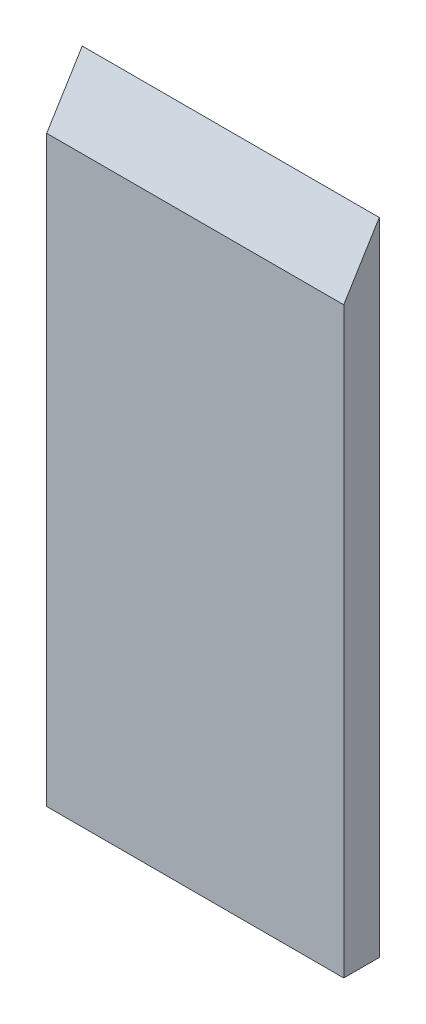
ISO-10303-21;
HEADER;
FILE_DESCRIPTION(('STEP AP214'),'2;1');
FILE_NAME('part.step','',(''),(''),'','','');
FILE_SCHEMA(('AUTOMOTIVE_DESIGN { 1 0 10303 214 1 1 1 1 }'));
ENDSEC;
DATA;
#1=APPLICATION_CONTEXT('core data for automotive mechanical design processes');
#2=APPLICATION_PROTOCOL_DEFINITION('international standard','automotive_design',2000,#1);
#3=PRODUCT_CONTEXT('',#1,'mechanical');
#4=PRODUCT('Part','Part','',(#3));
#5=PRODUCT_RELATED_PRODUCT_CATEGORY('part','',(#4));
#6=PRODUCT_DEFINITION_FORMATION('','',#4);
#7=PRODUCT_DEFINITION_CONTEXT('part definition',#1,'design');
#8=PRODUCT_DEFINITION('design','',#6,#7);
#9=PRODUCT_DEFINITION_SHAPE('','',#8);
#10=(LENGTH_UNIT() NAMED_UNIT(*) SI_UNIT(.MILLI.,.METRE.));
#11=(NAMED_UNIT(*) PLANE_ANGLE_UNIT() SI_UNIT($,.RADIAN.));
#12=(NAMED_UNIT(*) SI_UNIT($,.STERADIAN.) SOLID_ANGLE_UNIT());
#13=UNCERTAINTY_MEASURE_WITH_UNIT(LENGTH_MEASURE(1.E-05),#10,'distance_accuracy_value','');
#14=(GEOMETRIC_REPRESENTATION_CONTEXT(3) GLOBAL_UNCERTAINTY_ASSIGNED_CONTEXT((#13)) GLOBAL_UNIT_ASSIGNED_CONTEXT((#10,
#11,#12)) REPRESENTATION_CONTEXT('',''));
#15=CARTESIAN_POINT('',(0.,0.,0.));
#16=DIRECTION('',(0.,0.,1.));
#17=DIRECTION('',(1.,0.,0.));
#18=AXIS2_PLACEMENT_3D('',#15,#16,#17);
#19=CARTESIAN_POINT('',(-169.421875,775.633,-44.677734375));
#20=DIRECTION('',(1.,0.,0.));
#21=DIRECTION('',(0.,0.,-1.));
#22=AXIS2_PLACEMENT_3D('',#19,#20,#21);
#23=PLANE('',#22);
#24=DIRECTION('',(0.,-1.,0.));
#25=VECTOR('',#24,1.);
#26=CARTESIAN_POINT('',(-169.421875,775.633,-1.677734375));
#27=LINE('',#26,#25);
#28=CARTESIAN_POINT('',(-169.421875,705.637559040378,-1.67773437500026));
#29=VERTEX_POINT('',#28);
#30=CARTESIAN_POINT('',(-169.421875,0.,-1.677734375));
#31=VERTEX_POINT('',#30);
#32=EDGE_CURVE('E11',#29,#31,#27,.T.);
#33=ORIENTED_EDGE('',*,*,#32,.F.);
#34=DIRECTION('',(0.,0.852060781462288,-0.523442857142854));
#35=VECTOR('',#34,1.);
#36=CARTESIAN_POINT('',(-169.421875,775.633,-44.6777343750002));
#37=LINE('',#36,#35);
#38=CARTESIAN_POINT('',(-169.421875,775.633,-44.6777343750002));
#39=VERTEX_POINT('',#38);
#40=EDGE_CURVE('E95',#29,#39,#37,.T.);
#41=ORIENTED_EDGE('',*,*,#40,.T.);
#42=DIRECTION('',(0.,-1.,0.));
#43=VECTOR('',#42,1.);
#44=CARTESIAN_POINT('',(-169.421875,775.633,-44.677734375));
#45=LINE('',#44,#43);
#46=CARTESIAN_POINT('',(-169.421875,0.,-44.677734375));
#47=VERTEX_POINT('',#46);
#48=EDGE_CURVE('E81',#39,#47,#45,.T.);
#49=ORIENTED_EDGE('',*,*,#48,.T.);
#50=DIRECTION('',(0.,0.,1.));
#51=VECTOR('',#50,1.);
#52=CARTESIAN_POINT('',(-169.421875,0.,-44.677734375));
#53=LINE('',#52,#51);
#54=EDGE_CURVE('E86',#47,#31,#53,.T.);
#55=ORIENTED_EDGE('',*,*,#54,.T.);
#56=EDGE_LOOP('',(#33,#41,#49,#55));
#57=FACE_BOUND('',#56,.T.);
#58=ADVANCED_FACE('F33',(#57),#23,.F.);
#59=CARTESIAN_POINT('',(-169.421875,775.633,-1.677734375));
#60=DIRECTION('',(0.,0.,-1.));
#61=DIRECTION('',(-1.,0.,0.));
#62=AXIS2_PLACEMENT_3D('',#59,#60,#61);
#63=PLANE('',#62);
#64=DIRECTION('',(0.,-1.,0.));
#65=VECTOR('',#64,1.);
#66=CARTESIAN_POINT('',(190.078125,775.633,-1.677734375));
#67=LINE('',#66,#65);
#68=CARTESIAN_POINT('',(190.078125,705.637559040378,-1.67773437500003));
#69=VERTEX_POINT('',#68);
#70=CARTESIAN_POINT('',(190.078125,0.,-1.677734375));
#71=VERTEX_POINT('',#70);
#72=EDGE_CURVE('E41',#69,#71,#67,.T.);
#73=ORIENTED_EDGE('',*,*,#72,.F.);
#74=DIRECTION('',(1.,0.,0.));
#75=VECTOR('',#74,1.);
#76=CARTESIAN_POINT('',(-169.921875,705.637559040378,-1.67773437500026));
#77=LINE('',#76,#75);
#78=EDGE_CURVE('E100',#29,#69,#77,.T.);
#79=ORIENTED_EDGE('',*,*,#78,.F.);
#80=ORIENTED_EDGE('',*,*,#32,.T.);
#81=DIRECTION('',(1.,0.,0.));
#82=VECTOR('',#81,1.);
#83=CARTESIAN_POINT('',(-169.421875,0.,-1.677734375));
#84=LINE('',#83,#82);
#85=EDGE_CURVE('E74',#31,#71,#84,.T.);
#86=ORIENTED_EDGE('',*,*,#85,.T.);
#87=EDGE_LOOP('',(#73,#79,#80,#86));
#88=FACE_BOUND('',#87,.T.);
#89=ADVANCED_FACE('F105',(#88),#63,.F.);
#90=CARTESIAN_POINT('',(190.078125,775.633,-44.677734375));
#91=DIRECTION('',(-1.,0.,0.));
#92=DIRECTION('',(0.,0.,1.));
#93=AXIS2_PLACEMENT_3D('',#90,#91,#92);
#94=PLANE('',#93);
#95=DIRECTION('',(0.,-1.,0.));
#96=VECTOR('',#95,1.);
#97=CARTESIAN_POINT('',(190.078125,775.633,-44.677734375));
#98=LINE('',#97,#96);
#99=CARTESIAN_POINT('',(190.078125,775.633,-44.677734375));
#100=VERTEX_POINT('',#99);
#101=CARTESIAN_POINT('',(190.078125,0.,-44.677734375));
#102=VERTEX_POINT('',#101);
#103=EDGE_CURVE('E66',#100,#102,#98,.T.);
#104=ORIENTED_EDGE('',*,*,#103,.F.);
#105=DIRECTION('',(0.,0.852060781462288,-0.523442857142854));
#106=VECTOR('',#105,1.);
#107=CARTESIAN_POINT('',(190.078125,775.633,-44.677734375));
#108=LINE('',#107,#106);
#109=EDGE_CURVE('E48',#69,#100,#108,.T.);
#110=ORIENTED_EDGE('',*,*,#109,.F.);
#111=ORIENTED_EDGE('',*,*,#72,.T.);
#112=DIRECTION('',(0.,0.,-1.));
#113=VECTOR('',#112,1.);
#114=CARTESIAN_POINT('',(190.078125,0.,-44.677734375));
#115=LINE('',#114,#113);
#116=EDGE_CURVE('E63',#71,#102,#115,.T.);
#117=ORIENTED_EDGE('',*,*,#116,.T.);
#118=EDGE_LOOP('',(#104,#110,#111,#117));
#119=FACE_BOUND('',#118,.T.);
#120=ADVANCED_FACE('F65',(#119),#94,.F.);
#121=CARTESIAN_POINT('',(-169.421875,775.633,-44.677734375));
#122=DIRECTION('',(0.,0.,1.));
#123=DIRECTION('',(1.,0.,0.));
#124=AXIS2_PLACEMENT_3D('',#121,#122,#123);
#125=PLANE('',#124);
#126=DIRECTION('',(-1.,0.,0.));
#127=VECTOR('',#126,1.);
#128=CARTESIAN_POINT('',(-169.421875,0.,-44.677734375));
#129=LINE('',#128,#127);
#130=EDGE_CURVE('E73',#102,#47,#129,.T.);
#131=ORIENTED_EDGE('',*,*,#130,.T.);
#132=ORIENTED_EDGE('',*,*,#48,.F.);
#133=DIRECTION('',(-1.,0.,0.));
#134=VECTOR('',#133,1.);
#135=CARTESIAN_POINT('',(-169.421875,775.633,-44.677734375));
#136=LINE('',#135,#134);
#137=EDGE_CURVE('E80',#100,#39,#136,.T.);
#138=ORIENTED_EDGE('',*,*,#137,.F.);
#139=ORIENTED_EDGE('',*,*,#103,.T.);
#140=EDGE_LOOP('',(#131,#132,#138,#139));
#141=FACE_BOUND('',#140,.T.);
#142=ADVANCED_FACE('F77',(#141),#125,.F.);
#143=CARTESIAN_POINT('',(0.,0.,0.));
#144=DIRECTION('',(0.,1.,0.));
#145=DIRECTION('',(0.,0.,1.));
#146=AXIS2_PLACEMENT_3D('',#143,#144,#145);
#147=PLANE('',#146);
#148=ORIENTED_EDGE('',*,*,#54,.F.);
#149=ORIENTED_EDGE('',*,*,#130,.F.);
#150=ORIENTED_EDGE('',*,*,#116,.F.);
#151=ORIENTED_EDGE('',*,*,#85,.F.);
#152=EDGE_LOOP('',(#148,#149,#150,#151));
#153=FACE_BOUND('',#152,.T.);
#154=ADVANCED_FACE('F84',(#153),#147,.F.);
#155=CARTESIAN_POINT('',(-169.921875,775.633,-44.6777343750002));
#156=DIRECTION('',(0.,-0.523442857142854,-0.852060781462288));
#157=DIRECTION('',(0.,0.852060781462288,-0.523442857142854));
#158=AXIS2_PLACEMENT_3D('',#155,#156,#157);
#159=PLANE('',#158);
#160=ORIENTED_EDGE('',*,*,#78,.T.);
#161=ORIENTED_EDGE('',*,*,#109,.T.);
#162=ORIENTED_EDGE('',*,*,#137,.T.);
#163=ORIENTED_EDGE('',*,*,#40,.F.);
#164=EDGE_LOOP('',(#160,#161,#162,#163));
#165=FACE_BOUND('',#164,.T.);
#166=ADVANCED_FACE('F101',(#165),#159,.F.);
#167=CLOSED_SHELL('',(#58,#89,#120,#142,#154,#166));
#168=MANIFOLD_SOLID_BREP('B2',#167);
#169=ADVANCED_BREP_SHAPE_REPRESENTATION('',(#18,#168),#14);
#170=SHAPE_DEFINITION_REPRESENTATION(#9,#169);
ENDSEC;
END-ISO-10303-21;
